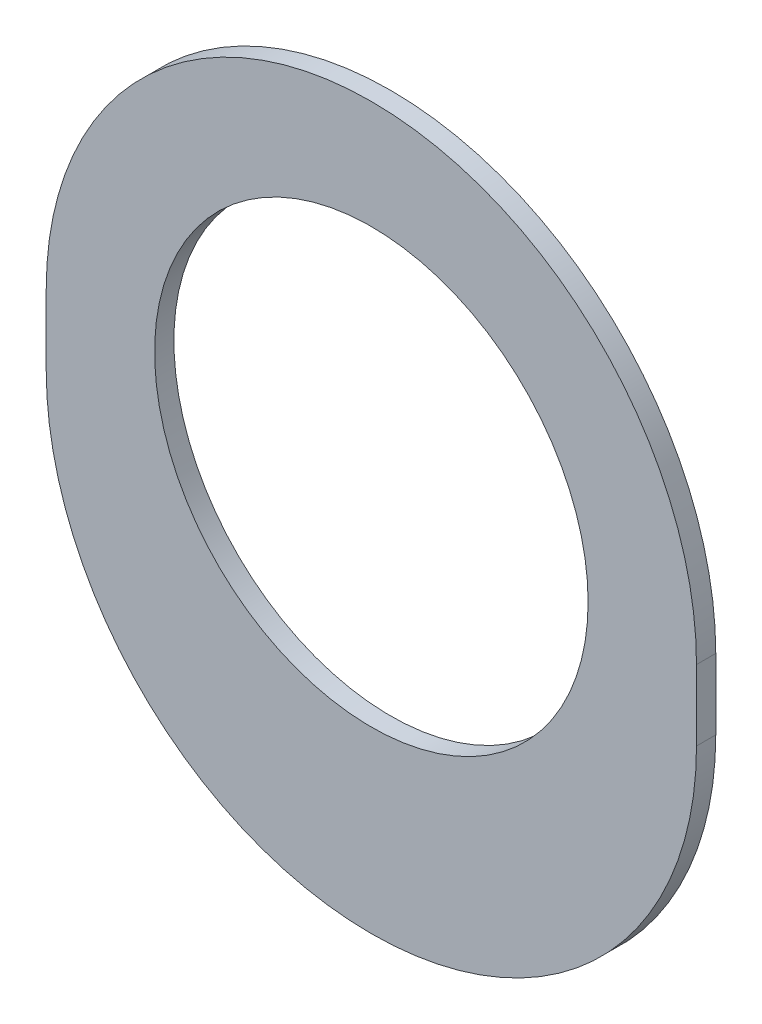
ISO-10303-21;
HEADER;
FILE_DESCRIPTION(('STEP AP214'),'2;1');
FILE_NAME('part.step','',(''),(''),'','','');
FILE_SCHEMA(('AUTOMOTIVE_DESIGN { 1 0 10303 214 1 1 1 1 }'));
ENDSEC;
DATA;
#1=APPLICATION_CONTEXT('core data for automotive mechanical design processes');
#2=APPLICATION_PROTOCOL_DEFINITION('international standard','automotive_design',2000,#1);
#3=PRODUCT_CONTEXT('',#1,'mechanical');
#4=PRODUCT('Part','Part','',(#3));
#5=PRODUCT_RELATED_PRODUCT_CATEGORY('part','',(#4));
#6=PRODUCT_DEFINITION_FORMATION('','',#4);
#7=PRODUCT_DEFINITION_CONTEXT('part definition',#1,'design');
#8=PRODUCT_DEFINITION('design','',#6,#7);
#9=PRODUCT_DEFINITION_SHAPE('','',#8);
#10=(LENGTH_UNIT() NAMED_UNIT(*) SI_UNIT(.MILLI.,.METRE.));
#11=(NAMED_UNIT(*) PLANE_ANGLE_UNIT() SI_UNIT($,.RADIAN.));
#12=(NAMED_UNIT(*) SI_UNIT($,.STERADIAN.) SOLID_ANGLE_UNIT());
#13=UNCERTAINTY_MEASURE_WITH_UNIT(LENGTH_MEASURE(1.E-05),#10,'distance_accuracy_value','');
#14=(GEOMETRIC_REPRESENTATION_CONTEXT(3) GLOBAL_UNCERTAINTY_ASSIGNED_CONTEXT((#13)) GLOBAL_UNIT_ASSIGNED_CONTEXT((#10,
#11,#12)) REPRESENTATION_CONTEXT('',''));
#15=CARTESIAN_POINT('',(0.,0.,0.));
#16=DIRECTION('',(0.,0.,1.));
#17=DIRECTION('',(1.,0.,0.));
#18=AXIS2_PLACEMENT_3D('',#15,#16,#17);
#19=CARTESIAN_POINT('',(75.0000024,87.90982418,0.));
#20=DIRECTION('',(-1.,0.,0.));
#21=DIRECTION('',(0.,1.,0.));
#22=AXIS2_PLACEMENT_3D('',#19,#20,#21);
#23=PLANE('',#22);
#24=DIRECTION('',(0.,1.,0.));
#25=VECTOR('',#24,1.);
#26=CARTESIAN_POINT('',(75.0000024,87.90982418,0.03556));
#27=LINE('',#26,#25);
#28=CARTESIAN_POINT('',(75.0000024,87.90982418,0.03556));
#29=VERTEX_POINT('',#28);
#30=CARTESIAN_POINT('',(75.0000024,88.0400068,0.03556));
#31=VERTEX_POINT('',#30);
#32=EDGE_CURVE('E11',#29,#31,#27,.T.);
#33=ORIENTED_EDGE('',*,*,#32,.F.);
#34=DIRECTION('',(0.,0.,1.));
#35=VECTOR('',#34,1.);
#36=CARTESIAN_POINT('',(75.0000024,87.90982418,0.));
#37=LINE('',#36,#35);
#38=CARTESIAN_POINT('',(75.0000024,87.90982418,0.));
#39=VERTEX_POINT('',#38);
#40=EDGE_CURVE('E24',#39,#29,#37,.T.);
#41=ORIENTED_EDGE('',*,*,#40,.F.);
#42=DIRECTION('',(0.,1.,0.));
#43=VECTOR('',#42,1.);
#44=CARTESIAN_POINT('',(75.0000024,87.90982418,0.));
#45=LINE('',#44,#43);
#46=CARTESIAN_POINT('',(75.0000024,88.0400068,0.));
#47=VERTEX_POINT('',#46);
#48=EDGE_CURVE('E96',#39,#47,#45,.T.);
#49=ORIENTED_EDGE('',*,*,#48,.T.);
#50=DIRECTION('',(0.,0.,1.));
#51=VECTOR('',#50,1.);
#52=CARTESIAN_POINT('',(75.0000024,88.0400068,0.));
#53=LINE('',#52,#51);
#54=EDGE_CURVE('E37',#47,#31,#53,.T.);
#55=ORIENTED_EDGE('',*,*,#54,.T.);
#56=EDGE_LOOP('',(#33,#41,#49,#55));
#57=FACE_BOUND('',#56,.T.);
#58=ADVANCED_FACE('F17',(#57),#23,.F.);
#59=CARTESIAN_POINT('',(74.4000036,87.90982418,0.));
#60=DIRECTION('',(0.,0.,-1.));
#61=DIRECTION('',(-1.,0.,0.));
#62=AXIS2_PLACEMENT_3D('',#59,#60,#61);
#63=CYLINDRICAL_SURFACE('',#62,0.599998799999999);
#64=CARTESIAN_POINT('',(74.4000036,87.90982418,0.03556));
#65=DIRECTION('',(0.,0.,1.));
#66=DIRECTION('',(-1.,0.,0.));
#67=AXIS2_PLACEMENT_3D('',#64,#65,#66);
#68=CIRCLE('',#67,0.599998799999999);
#69=CARTESIAN_POINT('',(73.8000048,87.90982418,0.03556));
#70=VERTEX_POINT('',#69);
#71=EDGE_CURVE('E92',#70,#29,#68,.T.);
#72=ORIENTED_EDGE('',*,*,#71,.F.);
#73=DIRECTION('',(0.,0.,1.));
#74=VECTOR('',#73,1.);
#75=CARTESIAN_POINT('',(73.8000048,87.90982418,0.));
#76=LINE('',#75,#74);
#77=CARTESIAN_POINT('',(73.8000048,87.90982418,0.));
#78=VERTEX_POINT('',#77);
#79=EDGE_CURVE('E90',#78,#70,#76,.T.);
#80=ORIENTED_EDGE('',*,*,#79,.F.);
#81=CARTESIAN_POINT('',(74.4000036,87.90982418,0.));
#82=DIRECTION('',(0.,0.,1.));
#83=DIRECTION('',(-1.,0.,0.));
#84=AXIS2_PLACEMENT_3D('',#81,#82,#83);
#85=CIRCLE('',#84,0.599998799999999);
#86=EDGE_CURVE('E88',#78,#39,#85,.T.);
#87=ORIENTED_EDGE('',*,*,#86,.T.);
#88=ORIENTED_EDGE('',*,*,#40,.T.);
#89=EDGE_LOOP('',(#72,#80,#87,#88));
#90=FACE_BOUND('',#89,.T.);
#91=ADVANCED_FACE('F111',(#90),#63,.T.);
#92=CARTESIAN_POINT('',(74.4000036,88.0400068,0.));
#93=DIRECTION('',(0.,0.,-1.));
#94=DIRECTION('',(1.,0.,0.));
#95=AXIS2_PLACEMENT_3D('',#92,#93,#94);
#96=CYLINDRICAL_SURFACE('',#95,0.599998799999999);
#97=CARTESIAN_POINT('',(74.4000036,88.0400068,0.03556));
#98=DIRECTION('',(0.,0.,1.));
#99=DIRECTION('',(1.,0.,0.));
#100=AXIS2_PLACEMENT_3D('',#97,#98,#99);
#101=CIRCLE('',#100,0.599998799999999);
#102=CARTESIAN_POINT('',(73.8000048,88.0400068,0.03556));
#103=VERTEX_POINT('',#102);
#104=EDGE_CURVE('E85',#31,#103,#101,.T.);
#105=ORIENTED_EDGE('',*,*,#104,.F.);
#106=ORIENTED_EDGE('',*,*,#54,.F.);
#107=CARTESIAN_POINT('',(74.4000036,88.0400068,0.));
#108=DIRECTION('',(0.,0.,1.));
#109=DIRECTION('',(1.,0.,0.));
#110=AXIS2_PLACEMENT_3D('',#107,#108,#109);
#111=CIRCLE('',#110,0.599998799999999);
#112=CARTESIAN_POINT('',(73.8000048,88.0400068,0.));
#113=VERTEX_POINT('',#112);
#114=EDGE_CURVE('E82',#47,#113,#111,.T.);
#115=ORIENTED_EDGE('',*,*,#114,.T.);
#116=DIRECTION('',(0.,0.,1.));
#117=VECTOR('',#116,1.);
#118=CARTESIAN_POINT('',(73.8000048,88.0400068,0.));
#119=LINE('',#118,#117);
#120=EDGE_CURVE('E80',#113,#103,#119,.T.);
#121=ORIENTED_EDGE('',*,*,#120,.T.);
#122=EDGE_LOOP('',(#105,#106,#115,#121));
#123=FACE_BOUND('',#122,.T.);
#124=ADVANCED_FACE('F104',(#123),#96,.T.);
#125=CARTESIAN_POINT('',(73.8000048,88.0400068,0.));
#126=DIRECTION('',(1.,0.,0.));
#127=DIRECTION('',(0.,-1.,0.));
#128=AXIS2_PLACEMENT_3D('',#125,#126,#127);
#129=PLANE('',#128);
#130=DIRECTION('',(0.,-1.,0.));
#131=VECTOR('',#130,1.);
#132=CARTESIAN_POINT('',(73.8000048,88.0400068,0.03556));
#133=LINE('',#132,#131);
#134=EDGE_CURVE('E77',#103,#70,#133,.T.);
#135=ORIENTED_EDGE('',*,*,#134,.F.);
#136=ORIENTED_EDGE('',*,*,#120,.F.);
#137=DIRECTION('',(0.,-1.,0.));
#138=VECTOR('',#137,1.);
#139=CARTESIAN_POINT('',(73.8000048,88.0400068,0.));
#140=LINE('',#139,#138);
#141=EDGE_CURVE('E68',#113,#78,#140,.T.);
#142=ORIENTED_EDGE('',*,*,#141,.T.);
#143=ORIENTED_EDGE('',*,*,#79,.T.);
#144=EDGE_LOOP('',(#135,#136,#142,#143));
#145=FACE_BOUND('',#144,.T.);
#146=ADVANCED_FACE('F110',(#145),#129,.F.);
#147=CARTESIAN_POINT('',(74.4000036,88.0400068,0.));
#148=DIRECTION('',(0.,0.,-1.));
#149=DIRECTION('',(1.,0.,0.));
#150=AXIS2_PLACEMENT_3D('',#147,#148,#149);
#151=CYLINDRICAL_SURFACE('',#150,0.3999992);
#152=DIRECTION('',(0.,0.,1.));
#153=VECTOR('',#152,1.);
#154=CARTESIAN_POINT('',(74.8000028,88.0400068,0.));
#155=LINE('',#154,#153);
#156=CARTESIAN_POINT('',(74.8000028,88.0400068,0.));
#157=VERTEX_POINT('',#156);
#158=CARTESIAN_POINT('',(74.8000028,88.0400068,0.03556));
#159=VERTEX_POINT('',#158);
#160=EDGE_CURVE('E62',#157,#159,#155,.T.);
#161=ORIENTED_EDGE('',*,*,#160,.T.);
#162=CARTESIAN_POINT('',(74.4000036,88.0400068,0.03556));
#163=DIRECTION('',(0.,0.,1.));
#164=DIRECTION('',(1.,0.,0.));
#165=AXIS2_PLACEMENT_3D('',#162,#163,#164);
#166=CIRCLE('',#165,0.3999992);
#167=EDGE_CURVE('E67',#159,#159,#166,.T.);
#168=ORIENTED_EDGE('',*,*,#167,.T.);
#169=ORIENTED_EDGE('',*,*,#160,.F.);
#170=CARTESIAN_POINT('',(74.4000036,88.0400068,0.));
#171=DIRECTION('',(0.,0.,1.));
#172=DIRECTION('',(1.,0.,0.));
#173=AXIS2_PLACEMENT_3D('',#170,#171,#172);
#174=CIRCLE('',#173,0.3999992);
#175=EDGE_CURVE('E65',#157,#157,#174,.T.);
#176=ORIENTED_EDGE('',*,*,#175,.F.);
#177=EDGE_LOOP('',(#161,#168,#169,#176));
#178=FACE_BOUND('',#177,.T.);
#179=ADVANCED_FACE('F64',(#178),#151,.F.);
#180=CARTESIAN_POINT('',(75.0000024,87.90982418,0.));
#181=DIRECTION('',(0.,0.,-1.));
#182=DIRECTION('',(-1.,0.,0.));
#183=AXIS2_PLACEMENT_3D('',#180,#181,#182);
#184=PLANE('',#183);
#185=ORIENTED_EDGE('',*,*,#48,.F.);
#186=ORIENTED_EDGE('',*,*,#86,.F.);
#187=ORIENTED_EDGE('',*,*,#141,.F.);
#188=ORIENTED_EDGE('',*,*,#114,.F.);
#189=EDGE_LOOP('',(#185,#186,#187,#188));
#190=FACE_BOUND('',#189,.T.);
#191=ORIENTED_EDGE('',*,*,#175,.T.);
#192=EDGE_LOOP('',(#191));
#193=FACE_BOUND('',#192,.T.);
#194=ADVANCED_FACE('F71',(#190,#193),#184,.T.);
#195=CARTESIAN_POINT('',(75.0000024,87.90982418,0.03556));
#196=DIRECTION('',(0.,0.,-1.));
#197=DIRECTION('',(-1.,0.,0.));
#198=AXIS2_PLACEMENT_3D('',#195,#196,#197);
#199=PLANE('',#198);
#200=ORIENTED_EDGE('',*,*,#134,.T.);
#201=ORIENTED_EDGE('',*,*,#71,.T.);
#202=ORIENTED_EDGE('',*,*,#32,.T.);
#203=ORIENTED_EDGE('',*,*,#104,.T.);
#204=EDGE_LOOP('',(#200,#201,#202,#203));
#205=FACE_BOUND('',#204,.T.);
#206=ORIENTED_EDGE('',*,*,#167,.F.);
#207=EDGE_LOOP('',(#206));
#208=FACE_BOUND('',#207,.T.);
#209=ADVANCED_FACE('F107',(#205,#208),#199,.F.);
#210=CLOSED_SHELL('',(#58,#91,#124,#146,#179,#194,#209));
#211=MANIFOLD_SOLID_BREP('B1',#210);
#212=ADVANCED_BREP_SHAPE_REPRESENTATION('',(#18,#211),#14);
#213=SHAPE_DEFINITION_REPRESENTATION(#9,#212);
ENDSEC;
END-ISO-10303-21;
